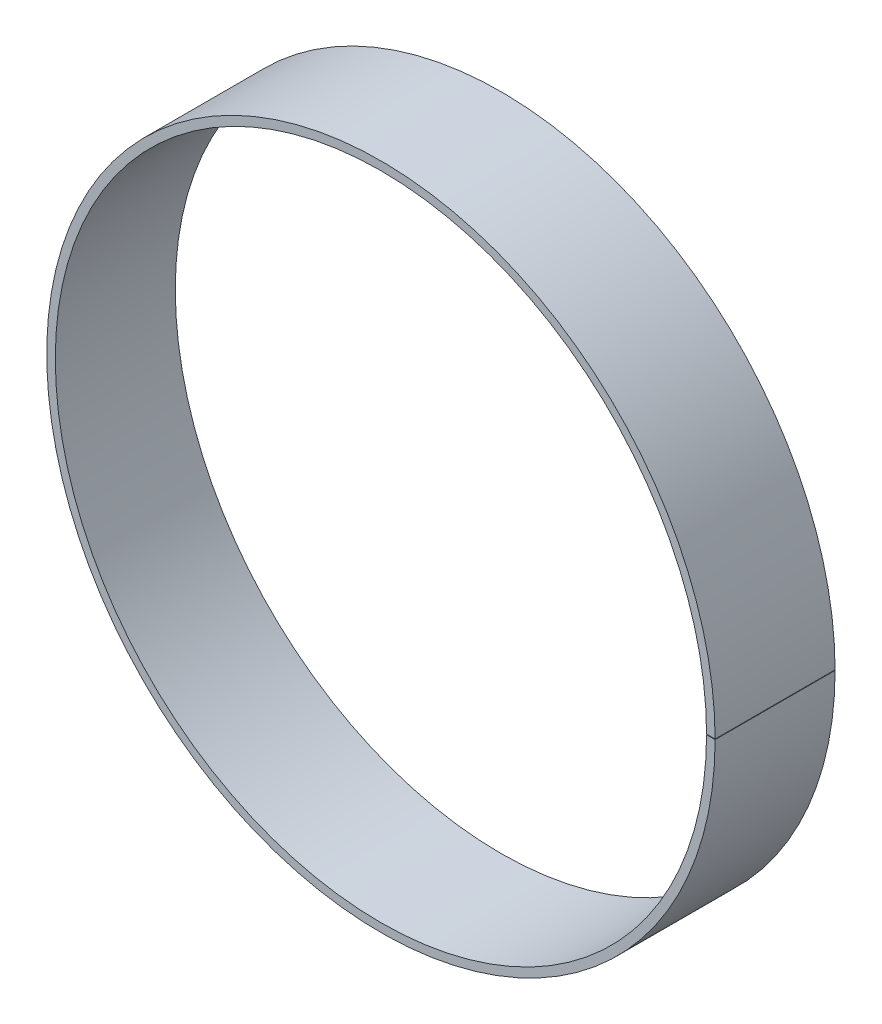
ISO-10303-21;
HEADER;
FILE_DESCRIPTION(('STEP AP214'),'2;1');
FILE_NAME('part.step','',(''),(''),'','','');
FILE_SCHEMA(('AUTOMOTIVE_DESIGN { 1 0 10303 214 1 1 1 1 }'));
ENDSEC;
DATA;
#1=APPLICATION_CONTEXT('core data for automotive mechanical design processes');
#2=APPLICATION_PROTOCOL_DEFINITION('international standard','automotive_design',2000,#1);
#3=PRODUCT_CONTEXT('',#1,'mechanical');
#4=PRODUCT('Part','Part','',(#3));
#5=PRODUCT_RELATED_PRODUCT_CATEGORY('part','',(#4));
#6=PRODUCT_DEFINITION_FORMATION('','',#4);
#7=PRODUCT_DEFINITION_CONTEXT('part definition',#1,'design');
#8=PRODUCT_DEFINITION('design','',#6,#7);
#9=PRODUCT_DEFINITION_SHAPE('','',#8);
#10=(LENGTH_UNIT() NAMED_UNIT(*) SI_UNIT(.MILLI.,.METRE.));
#11=(NAMED_UNIT(*) PLANE_ANGLE_UNIT() SI_UNIT($,.RADIAN.));
#12=(NAMED_UNIT(*) SI_UNIT($,.STERADIAN.) SOLID_ANGLE_UNIT());
#13=UNCERTAINTY_MEASURE_WITH_UNIT(LENGTH_MEASURE(1.E-05),#10,'distance_accuracy_value','');
#14=(GEOMETRIC_REPRESENTATION_CONTEXT(3) GLOBAL_UNCERTAINTY_ASSIGNED_CONTEXT((#13)) GLOBAL_UNIT_ASSIGNED_CONTEXT((#10,
#11,#12)) REPRESENTATION_CONTEXT('',''));
#15=CARTESIAN_POINT('',(0.,0.,0.));
#16=DIRECTION('',(0.,0.,1.));
#17=DIRECTION('',(1.,0.,0.));
#18=AXIS2_PLACEMENT_3D('',#15,#16,#17);
#19=CARTESIAN_POINT('',(0.,0.,56.));
#20=DIRECTION('',(0.,0.,-1.));
#21=DIRECTION('',(-1.,0.,0.));
#22=AXIS2_PLACEMENT_3D('',#19,#20,#21);
#23=CYLINDRICAL_SURFACE('',#22,156.);
#24=CARTESIAN_POINT('',(0.,0.,0.));
#25=DIRECTION('',(0.,0.,1.));
#26=DIRECTION('',(1.,0.,0.));
#27=AXIS2_PLACEMENT_3D('',#24,#25,#26);
#28=CIRCLE('',#27,156.);
#29=CARTESIAN_POINT('',(155.999799679359,0.25,0.));
#30=VERTEX_POINT('',#29);
#31=CARTESIAN_POINT('',(156.,0.,0.));
#32=VERTEX_POINT('',#31);
#33=EDGE_CURVE('E102',#30,#32,#28,.T.);
#34=ORIENTED_EDGE('',*,*,#33,.T.);
#35=DIRECTION('',(0.,0.,-1.));
#36=VECTOR('',#35,1.);
#37=CARTESIAN_POINT('',(156.,0.,56.));
#38=LINE('',#37,#36);
#39=CARTESIAN_POINT('',(156.,0.,56.));
#40=VERTEX_POINT('',#39);
#41=EDGE_CURVE('E11',#40,#32,#38,.T.);
#42=ORIENTED_EDGE('',*,*,#41,.F.);
#43=CARTESIAN_POINT('',(0.,0.,56.));
#44=DIRECTION('',(0.,0.,1.));
#45=DIRECTION('',(1.,0.,0.));
#46=AXIS2_PLACEMENT_3D('',#43,#44,#45);
#47=CIRCLE('',#46,156.);
#48=CARTESIAN_POINT('',(155.999799679359,0.25,56.));
#49=VERTEX_POINT('',#48);
#50=EDGE_CURVE('E79',#49,#40,#47,.T.);
#51=ORIENTED_EDGE('',*,*,#50,.F.);
#52=DIRECTION('',(0.,0.,-1.));
#53=VECTOR('',#52,1.);
#54=CARTESIAN_POINT('',(155.999799679359,0.25,56.));
#55=LINE('',#54,#53);
#56=EDGE_CURVE('E55',#49,#30,#55,.T.);
#57=ORIENTED_EDGE('',*,*,#56,.T.);
#58=EDGE_LOOP('',(#34,#42,#51,#57));
#59=FACE_BOUND('',#58,.T.);
#60=ADVANCED_FACE('F39',(#59),#23,.T.);
#61=CARTESIAN_POINT('',(152.,0.,56.));
#62=DIRECTION('',(0.,1.,0.));
#63=DIRECTION('',(0.,0.,1.));
#64=AXIS2_PLACEMENT_3D('',#61,#62,#63);
#65=PLANE('',#64);
#66=DIRECTION('',(1.,0.,0.));
#67=VECTOR('',#66,1.);
#68=CARTESIAN_POINT('',(152.,0.,0.));
#69=LINE('',#68,#67);
#70=CARTESIAN_POINT('',(152.,0.,0.));
#71=VERTEX_POINT('',#70);
#72=EDGE_CURVE('E88',#71,#32,#69,.T.);
#73=ORIENTED_EDGE('',*,*,#72,.F.);
#74=DIRECTION('',(0.,0.,-1.));
#75=VECTOR('',#74,1.);
#76=CARTESIAN_POINT('',(152.,0.,56.));
#77=LINE('',#76,#75);
#78=CARTESIAN_POINT('',(152.,0.,56.));
#79=VERTEX_POINT('',#78);
#80=EDGE_CURVE('E47',#79,#71,#77,.T.);
#81=ORIENTED_EDGE('',*,*,#80,.F.);
#82=DIRECTION('',(1.,0.,0.));
#83=VECTOR('',#82,1.);
#84=CARTESIAN_POINT('',(152.,0.,56.));
#85=LINE('',#84,#83);
#86=EDGE_CURVE('E86',#79,#40,#85,.T.);
#87=ORIENTED_EDGE('',*,*,#86,.T.);
#88=ORIENTED_EDGE('',*,*,#41,.T.);
#89=EDGE_LOOP('',(#73,#81,#87,#88));
#90=FACE_BOUND('',#89,.T.);
#91=ADVANCED_FACE('F85',(#90),#65,.T.);
#92=CARTESIAN_POINT('',(0.,0.,56.));
#93=DIRECTION('',(0.,0.,-1.));
#94=DIRECTION('',(-1.,0.,0.));
#95=AXIS2_PLACEMENT_3D('',#92,#93,#94);
#96=CYLINDRICAL_SURFACE('',#95,152.);
#97=CARTESIAN_POINT('',(0.,0.,0.));
#98=DIRECTION('',(0.,0.,1.));
#99=DIRECTION('',(1.,0.,0.));
#100=AXIS2_PLACEMENT_3D('',#97,#98,#99);
#101=CIRCLE('',#100,152.);
#102=CARTESIAN_POINT('',(151.999804815785,0.243589743589744,0.));
#103=VERTEX_POINT('',#102);
#104=EDGE_CURVE('E105',#103,#71,#101,.T.);
#105=ORIENTED_EDGE('',*,*,#104,.F.);
#106=DIRECTION('',(0.,0.,-1.));
#107=VECTOR('',#106,1.);
#108=CARTESIAN_POINT('',(151.999804815785,0.243589743589744,56.));
#109=LINE('',#108,#107);
#110=CARTESIAN_POINT('',(151.999804815785,0.243589743589744,56.));
#111=VERTEX_POINT('',#110);
#112=EDGE_CURVE('E68',#111,#103,#109,.T.);
#113=ORIENTED_EDGE('',*,*,#112,.F.);
#114=CARTESIAN_POINT('',(0.,0.,56.));
#115=DIRECTION('',(0.,0.,1.));
#116=DIRECTION('',(1.,0.,0.));
#117=AXIS2_PLACEMENT_3D('',#114,#115,#116);
#118=CIRCLE('',#117,152.);
#119=EDGE_CURVE('E94',#111,#79,#118,.T.);
#120=ORIENTED_EDGE('',*,*,#119,.T.);
#121=ORIENTED_EDGE('',*,*,#80,.T.);
#122=EDGE_LOOP('',(#105,#113,#120,#121));
#123=FACE_BOUND('',#122,.T.);
#124=ADVANCED_FACE('F96',(#123),#96,.F.);
#125=CARTESIAN_POINT('',(155.999799679359,0.25,56.));
#126=DIRECTION('',(0.00160256410256411,-0.999998715893324,0.));
#127=DIRECTION('',(0.999998715893324,0.00160256410256411,0.));
#128=AXIS2_PLACEMENT_3D('',#125,#126,#127);
#129=PLANE('',#128);
#130=DIRECTION('',(-0.999998715893324,-0.00160256410256411,0.));
#131=VECTOR('',#130,1.);
#132=CARTESIAN_POINT('',(155.999799679359,0.25,0.));
#133=LINE('',#132,#131);
#134=EDGE_CURVE('E107',#30,#103,#133,.T.);
#135=ORIENTED_EDGE('',*,*,#134,.F.);
#136=ORIENTED_EDGE('',*,*,#56,.F.);
#137=DIRECTION('',(-0.999998715893324,-0.00160256410256411,0.));
#138=VECTOR('',#137,1.);
#139=CARTESIAN_POINT('',(155.999799679359,0.25,56.));
#140=LINE('',#139,#138);
#141=EDGE_CURVE('E97',#49,#111,#140,.T.);
#142=ORIENTED_EDGE('',*,*,#141,.T.);
#143=ORIENTED_EDGE('',*,*,#112,.T.);
#144=EDGE_LOOP('',(#135,#136,#142,#143));
#145=FACE_BOUND('',#144,.T.);
#146=ADVANCED_FACE('F113',(#145),#129,.T.);
#147=CARTESIAN_POINT('',(0.,0.,56.));
#148=DIRECTION('',(0.,0.,1.));
#149=DIRECTION('',(1.,0.,0.));
#150=AXIS2_PLACEMENT_3D('',#147,#148,#149);
#151=PLANE('',#150);
#152=ORIENTED_EDGE('',*,*,#50,.T.);
#153=ORIENTED_EDGE('',*,*,#86,.F.);
#154=ORIENTED_EDGE('',*,*,#119,.F.);
#155=ORIENTED_EDGE('',*,*,#141,.F.);
#156=EDGE_LOOP('',(#152,#153,#154,#155));
#157=FACE_BOUND('',#156,.T.);
#158=ADVANCED_FACE('F93',(#157),#151,.T.);
#159=CARTESIAN_POINT('',(0.,0.,0.));
#160=DIRECTION('',(0.,0.,1.));
#161=DIRECTION('',(1.,0.,0.));
#162=AXIS2_PLACEMENT_3D('',#159,#160,#161);
#163=PLANE('',#162);
#164=ORIENTED_EDGE('',*,*,#33,.F.);
#165=ORIENTED_EDGE('',*,*,#134,.T.);
#166=ORIENTED_EDGE('',*,*,#104,.T.);
#167=ORIENTED_EDGE('',*,*,#72,.T.);
#168=EDGE_LOOP('',(#164,#165,#166,#167));
#169=FACE_BOUND('',#168,.T.);
#170=ADVANCED_FACE('F112',(#169),#163,.F.);
#171=CLOSED_SHELL('',(#60,#91,#124,#146,#158,#170));
#172=MANIFOLD_SOLID_BREP('B2',#171);
#173=ADVANCED_BREP_SHAPE_REPRESENTATION('',(#18,#172),#14);
#174=SHAPE_DEFINITION_REPRESENTATION(#9,#173);
ENDSEC;
END-ISO-10303-21;
